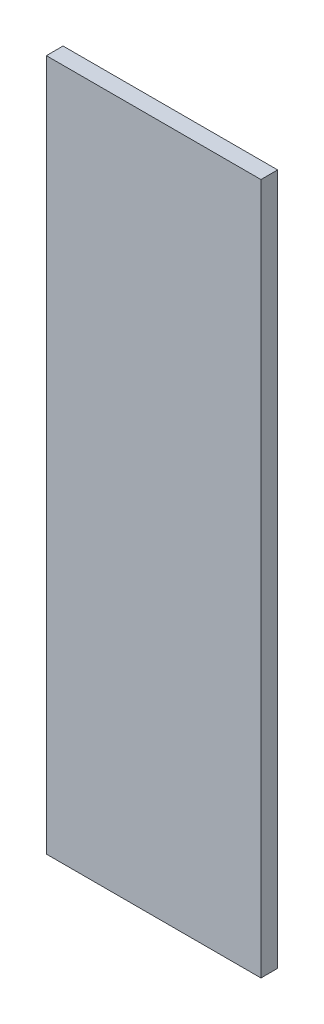
ISO-10303-21;
HEADER;
FILE_DESCRIPTION(('STEP AP214'),'2;1');
FILE_NAME('part.step','',(''),(''),'','','');
FILE_SCHEMA(('AUTOMOTIVE_DESIGN { 1 0 10303 214 1 1 1 1 }'));
ENDSEC;
DATA;
#1=APPLICATION_CONTEXT('core data for automotive mechanical design processes');
#2=APPLICATION_PROTOCOL_DEFINITION('international standard','automotive_design',2000,#1);
#3=PRODUCT_CONTEXT('',#1,'mechanical');
#4=PRODUCT('Part','Part','',(#3));
#5=PRODUCT_RELATED_PRODUCT_CATEGORY('part','',(#4));
#6=PRODUCT_DEFINITION_FORMATION('','',#4);
#7=PRODUCT_DEFINITION_CONTEXT('part definition',#1,'design');
#8=PRODUCT_DEFINITION('design','',#6,#7);
#9=PRODUCT_DEFINITION_SHAPE('','',#8);
#10=(LENGTH_UNIT() NAMED_UNIT(*) SI_UNIT(.MILLI.,.METRE.));
#11=(NAMED_UNIT(*) PLANE_ANGLE_UNIT() SI_UNIT($,.RADIAN.));
#12=(NAMED_UNIT(*) SI_UNIT($,.STERADIAN.) SOLID_ANGLE_UNIT());
#13=UNCERTAINTY_MEASURE_WITH_UNIT(LENGTH_MEASURE(1.E-05),#10,'distance_accuracy_value','');
#14=(GEOMETRIC_REPRESENTATION_CONTEXT(3) GLOBAL_UNCERTAINTY_ASSIGNED_CONTEXT((#13)) GLOBAL_UNIT_ASSIGNED_CONTEXT((#10,
#11,#12)) REPRESENTATION_CONTEXT('',''));
#15=CARTESIAN_POINT('',(0.,0.,0.));
#16=DIRECTION('',(0.,0.,1.));
#17=DIRECTION('',(1.,0.,0.));
#18=AXIS2_PLACEMENT_3D('',#15,#16,#17);
#19=CARTESIAN_POINT('',(85.,-131.365,1.635));
#20=DIRECTION('',(0.,0.,-1.));
#21=DIRECTION('',(0.,-1.,0.));
#22=AXIS2_PLACEMENT_3D('',#19,#20,#21);
#23=PLANE('',#22);
#24=DIRECTION('',(0.,-1.,0.));
#25=VECTOR('',#24,1.);
#26=CARTESIAN_POINT('',(85.225,-130.64,1.635));
#27=LINE('',#26,#25);
#28=CARTESIAN_POINT('',(85.225,-130.64,1.635));
#29=VERTEX_POINT('',#28);
#30=CARTESIAN_POINT('',(85.225,-132.09,1.635));
#31=VERTEX_POINT('',#30);
#32=EDGE_CURVE('E25',#29,#31,#27,.T.);
#33=ORIENTED_EDGE('',*,*,#32,.F.);
#34=DIRECTION('',(1.,0.,0.));
#35=VECTOR('',#34,1.);
#36=CARTESIAN_POINT('',(84.775,-130.64,1.635));
#37=LINE('',#36,#35);
#38=CARTESIAN_POINT('',(84.775,-130.64,1.635));
#39=VERTEX_POINT('',#38);
#40=EDGE_CURVE('E107',#39,#29,#37,.T.);
#41=ORIENTED_EDGE('',*,*,#40,.F.);
#42=DIRECTION('',(0.,1.,0.));
#43=VECTOR('',#42,1.);
#44=CARTESIAN_POINT('',(84.775,-132.09,1.635));
#45=LINE('',#44,#43);
#46=CARTESIAN_POINT('',(84.775,-132.09,1.635));
#47=VERTEX_POINT('',#46);
#48=EDGE_CURVE('E77',#47,#39,#45,.T.);
#49=ORIENTED_EDGE('',*,*,#48,.F.);
#50=DIRECTION('',(-1.,0.,0.));
#51=VECTOR('',#50,1.);
#52=CARTESIAN_POINT('',(85.225,-132.09,1.635));
#53=LINE('',#52,#51);
#54=EDGE_CURVE('E75',#31,#47,#53,.T.);
#55=ORIENTED_EDGE('',*,*,#54,.F.);
#56=EDGE_LOOP('',(#33,#41,#49,#55));
#57=FACE_BOUND('',#56,.T.);
#58=ADVANCED_FACE('F17',(#57),#23,.F.);
#59=CARTESIAN_POINT('',(85.,-131.365,1.6));
#60=DIRECTION('',(0.,0.,-1.));
#61=DIRECTION('',(0.,-1.,0.));
#62=AXIS2_PLACEMENT_3D('',#59,#60,#61);
#63=PLANE('',#62);
#64=DIRECTION('',(-1.,0.,0.));
#65=VECTOR('',#64,1.);
#66=CARTESIAN_POINT('',(85.225,-132.09,1.6));
#67=LINE('',#66,#65);
#68=CARTESIAN_POINT('',(85.225,-132.09,1.6));
#69=VERTEX_POINT('',#68);
#70=CARTESIAN_POINT('',(84.775,-132.09,1.6));
#71=VERTEX_POINT('',#70);
#72=EDGE_CURVE('E87',#69,#71,#67,.T.);
#73=ORIENTED_EDGE('',*,*,#72,.T.);
#74=DIRECTION('',(0.,1.,0.));
#75=VECTOR('',#74,1.);
#76=CARTESIAN_POINT('',(84.775,-132.09,1.6));
#77=LINE('',#76,#75);
#78=CARTESIAN_POINT('',(84.775,-130.64,1.6));
#79=VERTEX_POINT('',#78);
#80=EDGE_CURVE('E103',#71,#79,#77,.T.);
#81=ORIENTED_EDGE('',*,*,#80,.T.);
#82=DIRECTION('',(1.,0.,0.));
#83=VECTOR('',#82,1.);
#84=CARTESIAN_POINT('',(84.775,-130.64,1.6));
#85=LINE('',#84,#83);
#86=CARTESIAN_POINT('',(85.225,-130.64,1.6));
#87=VERTEX_POINT('',#86);
#88=EDGE_CURVE('E73',#79,#87,#85,.T.);
#89=ORIENTED_EDGE('',*,*,#88,.T.);
#90=DIRECTION('',(0.,-1.,0.));
#91=VECTOR('',#90,1.);
#92=CARTESIAN_POINT('',(85.225,-130.64,1.6));
#93=LINE('',#92,#91);
#94=EDGE_CURVE('E11',#87,#69,#93,.T.);
#95=ORIENTED_EDGE('',*,*,#94,.T.);
#96=EDGE_LOOP('',(#73,#81,#89,#95));
#97=FACE_BOUND('',#96,.T.);
#98=ADVANCED_FACE('F149',(#97),#63,.T.);
#99=CARTESIAN_POINT('',(85.225,-130.64,1.6));
#100=DIRECTION('',(1.,0.,0.));
#101=DIRECTION('',(0.,1.,0.));
#102=AXIS2_PLACEMENT_3D('',#99,#100,#101);
#103=PLANE('',#102);
#104=DIRECTION('',(0.,0.,1.));
#105=VECTOR('',#104,1.);
#106=CARTESIAN_POINT('',(85.225,-130.64,1.6));
#107=LINE('',#106,#105);
#108=EDGE_CURVE('E70',#87,#29,#107,.T.);
#109=ORIENTED_EDGE('',*,*,#108,.T.);
#110=ORIENTED_EDGE('',*,*,#32,.T.);
#111=DIRECTION('',(0.,0.,1.));
#112=VECTOR('',#111,1.);
#113=CARTESIAN_POINT('',(85.225,-132.09,1.6));
#114=LINE('',#113,#112);
#115=EDGE_CURVE('E68',#69,#31,#114,.T.);
#116=ORIENTED_EDGE('',*,*,#115,.F.);
#117=ORIENTED_EDGE('',*,*,#94,.F.);
#118=EDGE_LOOP('',(#109,#110,#116,#117));
#119=FACE_BOUND('',#118,.T.);
#120=ADVANCED_FACE('F66',(#119),#103,.T.);
#121=CARTESIAN_POINT('',(84.775,-130.64,1.6));
#122=DIRECTION('',(0.,1.,0.));
#123=DIRECTION('',(1.,0.,0.));
#124=AXIS2_PLACEMENT_3D('',#121,#122,#123);
#125=PLANE('',#124);
#126=DIRECTION('',(0.,0.,1.));
#127=VECTOR('',#126,1.);
#128=CARTESIAN_POINT('',(84.775,-130.64,1.6));
#129=LINE('',#128,#127);
#130=EDGE_CURVE('E99',#79,#39,#129,.T.);
#131=ORIENTED_EDGE('',*,*,#130,.T.);
#132=ORIENTED_EDGE('',*,*,#40,.T.);
#133=ORIENTED_EDGE('',*,*,#108,.F.);
#134=ORIENTED_EDGE('',*,*,#88,.F.);
#135=EDGE_LOOP('',(#131,#132,#133,#134));
#136=FACE_BOUND('',#135,.T.);
#137=ADVANCED_FACE('F151',(#136),#125,.T.);
#138=CARTESIAN_POINT('',(84.775,-132.09,1.6));
#139=DIRECTION('',(-1.,0.,0.));
#140=DIRECTION('',(0.,0.,1.));
#141=AXIS2_PLACEMENT_3D('',#138,#139,#140);
#142=PLANE('',#141);
#143=DIRECTION('',(0.,0.,1.));
#144=VECTOR('',#143,1.);
#145=CARTESIAN_POINT('',(84.775,-132.09,1.6));
#146=LINE('',#145,#144);
#147=EDGE_CURVE('E82',#71,#47,#146,.T.);
#148=ORIENTED_EDGE('',*,*,#147,.T.);
#149=ORIENTED_EDGE('',*,*,#48,.T.);
#150=ORIENTED_EDGE('',*,*,#130,.F.);
#151=ORIENTED_EDGE('',*,*,#80,.F.);
#152=EDGE_LOOP('',(#148,#149,#150,#151));
#153=FACE_BOUND('',#152,.T.);
#154=ADVANCED_FACE('F146',(#153),#142,.T.);
#155=CARTESIAN_POINT('',(85.225,-132.09,1.6));
#156=DIRECTION('',(0.,-1.,0.));
#157=DIRECTION('',(0.,0.,-1.));
#158=AXIS2_PLACEMENT_3D('',#155,#156,#157);
#159=PLANE('',#158);
#160=ORIENTED_EDGE('',*,*,#115,.T.);
#161=ORIENTED_EDGE('',*,*,#54,.T.);
#162=ORIENTED_EDGE('',*,*,#147,.F.);
#163=ORIENTED_EDGE('',*,*,#72,.F.);
#164=EDGE_LOOP('',(#160,#161,#162,#163));
#165=FACE_BOUND('',#164,.T.);
#166=ADVANCED_FACE('F85',(#165),#159,.T.);
#167=CLOSED_SHELL('',(#58,#98,#120,#137,#154,#166));
#168=MANIFOLD_SOLID_BREP('B1',#167);
#169=ADVANCED_BREP_SHAPE_REPRESENTATION('',(#18,#168),#14);
#170=SHAPE_DEFINITION_REPRESENTATION(#9,#169);
ENDSEC;
END-ISO-10303-21;
